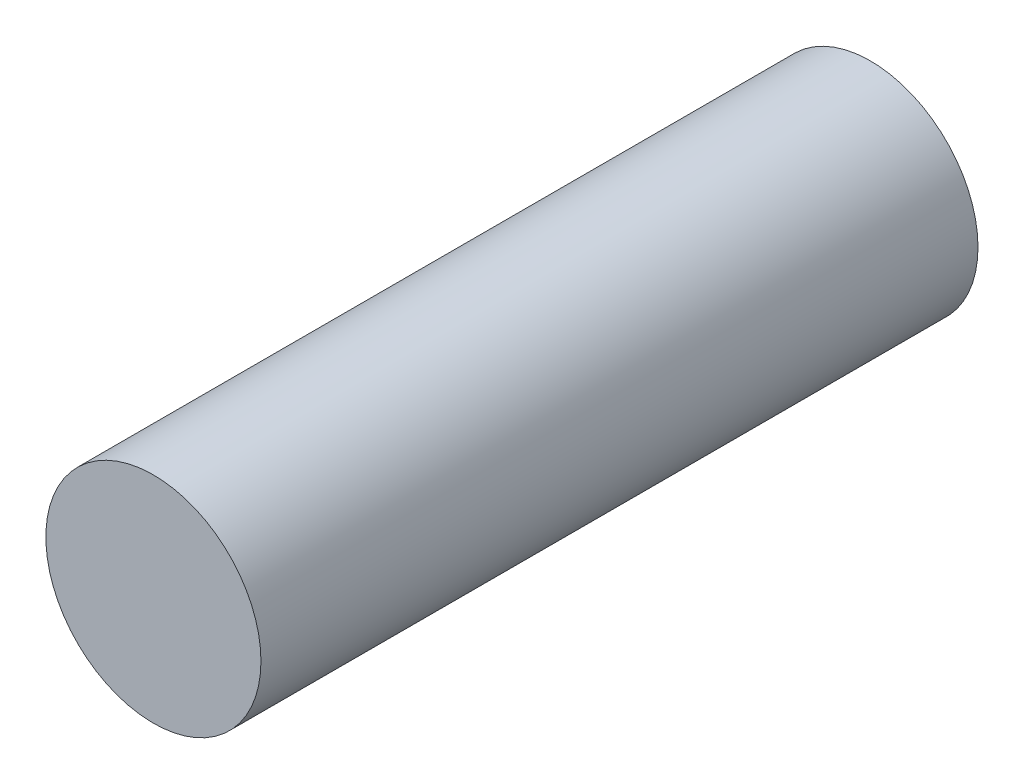
ISO-10303-21;
HEADER;
FILE_DESCRIPTION(('STEP AP214'),'2;1');
FILE_NAME('part.step','',(''),(''),'','','');
FILE_SCHEMA(('AUTOMOTIVE_DESIGN { 1 0 10303 214 1 1 1 1 }'));
ENDSEC;
DATA;
#1=APPLICATION_CONTEXT('core data for automotive mechanical design processes');
#2=APPLICATION_PROTOCOL_DEFINITION('international standard','automotive_design',2000,#1);
#3=PRODUCT_CONTEXT('',#1,'mechanical');
#4=PRODUCT('Part','Part','',(#3));
#5=PRODUCT_RELATED_PRODUCT_CATEGORY('part','',(#4));
#6=PRODUCT_DEFINITION_FORMATION('','',#4);
#7=PRODUCT_DEFINITION_CONTEXT('part definition',#1,'design');
#8=PRODUCT_DEFINITION('design','',#6,#7);
#9=PRODUCT_DEFINITION_SHAPE('','',#8);
#10=(LENGTH_UNIT() NAMED_UNIT(*) SI_UNIT(.MILLI.,.METRE.));
#11=(NAMED_UNIT(*) PLANE_ANGLE_UNIT() SI_UNIT($,.RADIAN.));
#12=(NAMED_UNIT(*) SI_UNIT($,.STERADIAN.) SOLID_ANGLE_UNIT());
#13=UNCERTAINTY_MEASURE_WITH_UNIT(LENGTH_MEASURE(1.E-05),#10,'distance_accuracy_value','');
#14=(GEOMETRIC_REPRESENTATION_CONTEXT(3) GLOBAL_UNCERTAINTY_ASSIGNED_CONTEXT((#13)) GLOBAL_UNIT_ASSIGNED_CONTEXT((#10,
#11,#12)) REPRESENTATION_CONTEXT('',''));
#15=CARTESIAN_POINT('',(0.,0.,0.));
#16=DIRECTION('',(0.,0.,1.));
#17=DIRECTION('',(1.,0.,0.));
#18=AXIS2_PLACEMENT_3D('',#15,#16,#17);
#19=CARTESIAN_POINT('',(0.,0.,60.));
#20=DIRECTION('',(0.,0.,-1.));
#21=DIRECTION('',(-1.,0.,0.));
#22=AXIS2_PLACEMENT_3D('',#19,#20,#21);
#23=CYLINDRICAL_SURFACE('',#22,9.);
#24=CARTESIAN_POINT('',(0.,0.,60.));
#25=DIRECTION('',(0.,0.,1.));
#26=DIRECTION('',(1.,0.,0.));
#27=AXIS2_PLACEMENT_3D('',#24,#25,#26);
#28=CIRCLE('',#27,9.);
#29=CARTESIAN_POINT('',(9.,0.,60.));
#30=VERTEX_POINT('',#29);
#31=EDGE_CURVE('E10',#30,#30,#28,.T.);
#32=ORIENTED_EDGE('',*,*,#31,.F.);
#33=EDGE_LOOP('',(#32));
#34=FACE_BOUND('',#33,.T.);
#35=CARTESIAN_POINT('',(0.,0.,0.));
#36=DIRECTION('',(0.,0.,1.));
#37=DIRECTION('',(1.,0.,0.));
#38=AXIS2_PLACEMENT_3D('',#35,#36,#37);
#39=CIRCLE('',#38,9.);
#40=CARTESIAN_POINT('',(9.,0.,0.));
#41=VERTEX_POINT('',#40);
#42=EDGE_CURVE('E46',#41,#41,#39,.T.);
#43=ORIENTED_EDGE('',*,*,#42,.T.);
#44=EDGE_LOOP('',(#43));
#45=FACE_BOUND('',#44,.T.);
#46=ADVANCED_FACE('F43',(#34,#45),#23,.T.);
#47=CARTESIAN_POINT('',(0.,0.,60.));
#48=DIRECTION('',(0.,0.,1.));
#49=DIRECTION('',(1.,0.,0.));
#50=AXIS2_PLACEMENT_3D('',#47,#48,#49);
#51=PLANE('',#50);
#52=ORIENTED_EDGE('',*,*,#31,.T.);
#53=EDGE_LOOP('',(#52));
#54=FACE_BOUND('',#53,.T.);
#55=ADVANCED_FACE('F58',(#54),#51,.T.);
#56=CARTESIAN_POINT('',(0.,0.,0.));
#57=DIRECTION('',(0.,0.,1.));
#58=DIRECTION('',(1.,0.,0.));
#59=AXIS2_PLACEMENT_3D('',#56,#57,#58);
#60=PLANE('',#59);
#61=ORIENTED_EDGE('',*,*,#42,.F.);
#62=EDGE_LOOP('',(#61));
#63=FACE_BOUND('',#62,.T.);
#64=ADVANCED_FACE('F56',(#63),#60,.F.);
#65=CLOSED_SHELL('',(#46,#55,#64));
#66=MANIFOLD_SOLID_BREP('B2',#65);
#67=ADVANCED_BREP_SHAPE_REPRESENTATION('',(#18,#66),#14);
#68=SHAPE_DEFINITION_REPRESENTATION(#9,#67);
ENDSEC;
END-ISO-10303-21;
